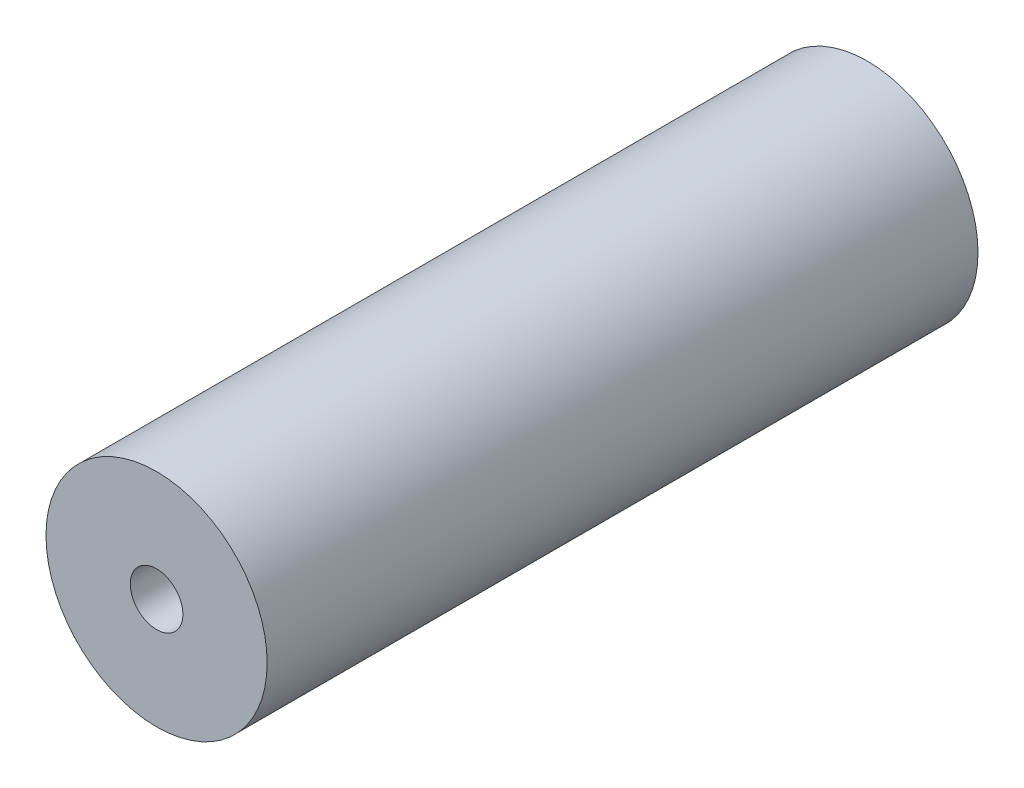
ISO-10303-21;
HEADER;
FILE_DESCRIPTION(('STEP AP214'),'2;1');
FILE_NAME('part.step','',(''),(''),'','','');
FILE_SCHEMA(('AUTOMOTIVE_DESIGN { 1 0 10303 214 1 1 1 1 }'));
ENDSEC;
DATA;
#1=APPLICATION_CONTEXT('core data for automotive mechanical design processes');
#2=APPLICATION_PROTOCOL_DEFINITION('international standard','automotive_design',2000,#1);
#3=PRODUCT_CONTEXT('',#1,'mechanical');
#4=PRODUCT('Part','Part','',(#3));
#5=PRODUCT_RELATED_PRODUCT_CATEGORY('part','',(#4));
#6=PRODUCT_DEFINITION_FORMATION('','',#4);
#7=PRODUCT_DEFINITION_CONTEXT('part definition',#1,'design');
#8=PRODUCT_DEFINITION('design','',#6,#7);
#9=PRODUCT_DEFINITION_SHAPE('','',#8);
#10=(LENGTH_UNIT() NAMED_UNIT(*) SI_UNIT(.MILLI.,.METRE.));
#11=(NAMED_UNIT(*) PLANE_ANGLE_UNIT() SI_UNIT($,.RADIAN.));
#12=(NAMED_UNIT(*) SI_UNIT($,.STERADIAN.) SOLID_ANGLE_UNIT());
#13=UNCERTAINTY_MEASURE_WITH_UNIT(LENGTH_MEASURE(1.E-05),#10,'distance_accuracy_value','');
#14=(GEOMETRIC_REPRESENTATION_CONTEXT(3) GLOBAL_UNCERTAINTY_ASSIGNED_CONTEXT((#13)) GLOBAL_UNIT_ASSIGNED_CONTEXT((#10,
#11,#12)) REPRESENTATION_CONTEXT('',''));
#15=CARTESIAN_POINT('',(0.,0.,0.));
#16=DIRECTION('',(0.,0.,1.));
#17=DIRECTION('',(1.,0.,0.));
#18=AXIS2_PLACEMENT_3D('',#15,#16,#17);
#19=CARTESIAN_POINT('',(0.,0.,-67.5));
#20=DIRECTION('',(0.,0.,1.));
#21=DIRECTION('',(1.,0.,0.));
#22=AXIS2_PLACEMENT_3D('',#19,#20,#21);
#23=CYLINDRICAL_SURFACE('',#22,21.);
#24=CARTESIAN_POINT('',(0.,0.,-67.5));
#25=DIRECTION('',(0.,0.,1.));
#26=DIRECTION('',(1.,0.,0.));
#27=AXIS2_PLACEMENT_3D('',#24,#25,#26);
#28=CIRCLE('',#27,21.);
#29=CARTESIAN_POINT('',(21.,0.,-67.5));
#30=VERTEX_POINT('',#29);
#31=EDGE_CURVE('E10',#30,#30,#28,.T.);
#32=ORIENTED_EDGE('',*,*,#31,.T.);
#33=EDGE_LOOP('',(#32));
#34=FACE_BOUND('',#33,.T.);
#35=CARTESIAN_POINT('',(0.,0.,67.5));
#36=DIRECTION('',(0.,0.,1.));
#37=DIRECTION('',(1.,0.,0.));
#38=AXIS2_PLACEMENT_3D('',#35,#36,#37);
#39=CIRCLE('',#38,21.);
#40=CARTESIAN_POINT('',(21.,0.,67.5));
#41=VERTEX_POINT('',#40);
#42=EDGE_CURVE('E41',#41,#41,#39,.T.);
#43=ORIENTED_EDGE('',*,*,#42,.F.);
#44=EDGE_LOOP('',(#43));
#45=FACE_BOUND('',#44,.T.);
#46=ADVANCED_FACE('F35',(#34,#45),#23,.T.);
#47=CARTESIAN_POINT('',(0.,0.,-67.5));
#48=DIRECTION('',(0.,0.,1.));
#49=DIRECTION('',(1.,0.,0.));
#50=AXIS2_PLACEMENT_3D('',#47,#48,#49);
#51=PLANE('',#50);
#52=CARTESIAN_POINT('',(0.,17.5,-67.5));
#53=DIRECTION('',(0.,0.,-1.));
#54=DIRECTION('',(-1.,0.,0.));
#55=AXIS2_PLACEMENT_3D('',#52,#53,#54);
#56=CIRCLE('',#55,2.);
#57=CARTESIAN_POINT('',(-2.,17.5,-67.5));
#58=VERTEX_POINT('',#57);
#59=EDGE_CURVE('E73',#58,#58,#56,.T.);
#60=ORIENTED_EDGE('',*,*,#59,.F.);
#61=EDGE_LOOP('',(#60));
#62=FACE_BOUND('',#61,.T.);
#63=CARTESIAN_POINT('',(-17.5,0.,-67.5));
#64=DIRECTION('',(0.,0.,-1.));
#65=DIRECTION('',(-1.,0.,0.));
#66=AXIS2_PLACEMENT_3D('',#63,#64,#65);
#67=CIRCLE('',#66,2.);
#68=CARTESIAN_POINT('',(-19.5,0.,-67.5));
#69=VERTEX_POINT('',#68);
#70=EDGE_CURVE('E67',#69,#69,#67,.T.);
#71=ORIENTED_EDGE('',*,*,#70,.F.);
#72=EDGE_LOOP('',(#71));
#73=FACE_BOUND('',#72,.T.);
#74=CARTESIAN_POINT('',(0.,-17.5,-67.5));
#75=DIRECTION('',(0.,0.,-1.));
#76=DIRECTION('',(-1.,0.,0.));
#77=AXIS2_PLACEMENT_3D('',#74,#75,#76);
#78=CIRCLE('',#77,2.);
#79=CARTESIAN_POINT('',(-2.,-17.5,-67.5));
#80=VERTEX_POINT('',#79);
#81=EDGE_CURVE('E61',#80,#80,#78,.T.);
#82=ORIENTED_EDGE('',*,*,#81,.F.);
#83=EDGE_LOOP('',(#82));
#84=FACE_BOUND('',#83,.T.);
#85=CARTESIAN_POINT('',(17.5,0.,-67.5));
#86=DIRECTION('',(0.,0.,-1.));
#87=DIRECTION('',(-1.,0.,0.));
#88=AXIS2_PLACEMENT_3D('',#85,#86,#87);
#89=CIRCLE('',#88,2.);
#90=CARTESIAN_POINT('',(15.5,0.,-67.5));
#91=VERTEX_POINT('',#90);
#92=EDGE_CURVE('E55',#91,#91,#89,.T.);
#93=ORIENTED_EDGE('',*,*,#92,.F.);
#94=EDGE_LOOP('',(#93));
#95=FACE_BOUND('',#94,.T.);
#96=CARTESIAN_POINT('',(0.,0.,-67.5));
#97=DIRECTION('',(0.,0.,1.));
#98=DIRECTION('',(1.,0.,0.));
#99=AXIS2_PLACEMENT_3D('',#96,#97,#98);
#100=CIRCLE('',#99,5.);
#101=CARTESIAN_POINT('',(5.,0.,-67.5));
#102=VERTEX_POINT('',#101);
#103=EDGE_CURVE('E45',#102,#102,#100,.T.);
#104=ORIENTED_EDGE('',*,*,#103,.T.);
#105=EDGE_LOOP('',(#104));
#106=FACE_BOUND('',#105,.T.);
#107=ORIENTED_EDGE('',*,*,#31,.F.);
#108=EDGE_LOOP('',(#107));
#109=FACE_BOUND('',#108,.T.);
#110=ADVANCED_FACE('F88',(#62,#73,#84,#95,#106,#109),#51,.F.);
#111=CARTESIAN_POINT('',(0.,0.,67.5));
#112=DIRECTION('',(0.,0.,1.));
#113=DIRECTION('',(1.,0.,0.));
#114=AXIS2_PLACEMENT_3D('',#111,#112,#113);
#115=PLANE('',#114);
#116=CARTESIAN_POINT('',(0.,0.,67.5));
#117=DIRECTION('',(0.,0.,1.));
#118=DIRECTION('',(1.,0.,0.));
#119=AXIS2_PLACEMENT_3D('',#116,#117,#118);
#120=CIRCLE('',#119,5.);
#121=CARTESIAN_POINT('',(5.,0.,67.5));
#122=VERTEX_POINT('',#121);
#123=EDGE_CURVE('E49',#122,#122,#120,.T.);
#124=ORIENTED_EDGE('',*,*,#123,.F.);
#125=EDGE_LOOP('',(#124));
#126=FACE_BOUND('',#125,.T.);
#127=ORIENTED_EDGE('',*,*,#42,.T.);
#128=EDGE_LOOP('',(#127));
#129=FACE_BOUND('',#128,.T.);
#130=ADVANCED_FACE('F91',(#126,#129),#115,.T.);
#131=CARTESIAN_POINT('',(0.,0.,-67.5));
#132=DIRECTION('',(0.,0.,1.));
#133=DIRECTION('',(1.,0.,0.));
#134=AXIS2_PLACEMENT_3D('',#131,#132,#133);
#135=CYLINDRICAL_SURFACE('',#134,5.);
#136=ORIENTED_EDGE('',*,*,#103,.F.);
#137=EDGE_LOOP('',(#136));
#138=FACE_BOUND('',#137,.T.);
#139=ORIENTED_EDGE('',*,*,#123,.T.);
#140=EDGE_LOOP('',(#139));
#141=FACE_BOUND('',#140,.T.);
#142=ADVANCED_FACE('F101',(#138,#141),#135,.F.);
#143=CARTESIAN_POINT('',(17.5,0.,-58.5));
#144=DIRECTION('',(0.,0.,-1.));
#145=DIRECTION('',(-1.,0.,0.));
#146=AXIS2_PLACEMENT_3D('',#143,#144,#145);
#147=CYLINDRICAL_SURFACE('',#146,2.);
#148=CARTESIAN_POINT('',(17.5,0.,-58.5));
#149=DIRECTION('',(0.,0.,-1.));
#150=DIRECTION('',(-1.,0.,0.));
#151=AXIS2_PLACEMENT_3D('',#148,#149,#150);
#152=CIRCLE('',#151,2.);
#153=CARTESIAN_POINT('',(15.5,0.,-58.5));
#154=VERTEX_POINT('',#153);
#155=EDGE_CURVE('E58',#154,#154,#152,.T.);
#156=ORIENTED_EDGE('',*,*,#155,.F.);
#157=EDGE_LOOP('',(#156));
#158=FACE_BOUND('',#157,.T.);
#159=ORIENTED_EDGE('',*,*,#92,.T.);
#160=EDGE_LOOP('',(#159));
#161=FACE_BOUND('',#160,.T.);
#162=ADVANCED_FACE('F104',(#158,#161),#147,.F.);
#163=CARTESIAN_POINT('',(17.5,0.,-58.5));
#164=DIRECTION('',(0.,0.,-1.));
#165=DIRECTION('',(-1.,0.,0.));
#166=AXIS2_PLACEMENT_3D('',#163,#164,#165);
#167=PLANE('',#166);
#168=ORIENTED_EDGE('',*,*,#155,.T.);
#169=EDGE_LOOP('',(#168));
#170=FACE_BOUND('',#169,.T.);
#171=ADVANCED_FACE('F133',(#170),#167,.T.);
#172=CARTESIAN_POINT('',(0.,-17.5,-58.5));
#173=DIRECTION('',(0.,0.,-1.));
#174=DIRECTION('',(-1.,0.,0.));
#175=AXIS2_PLACEMENT_3D('',#172,#173,#174);
#176=CYLINDRICAL_SURFACE('',#175,2.);
#177=CARTESIAN_POINT('',(0.,-17.5,-58.5));
#178=DIRECTION('',(0.,0.,-1.));
#179=DIRECTION('',(-1.,0.,0.));
#180=AXIS2_PLACEMENT_3D('',#177,#178,#179);
#181=CIRCLE('',#180,2.);
#182=CARTESIAN_POINT('',(-2.,-17.5,-58.5));
#183=VERTEX_POINT('',#182);
#184=EDGE_CURVE('E64',#183,#183,#181,.T.);
#185=ORIENTED_EDGE('',*,*,#184,.F.);
#186=EDGE_LOOP('',(#185));
#187=FACE_BOUND('',#186,.T.);
#188=ORIENTED_EDGE('',*,*,#81,.T.);
#189=EDGE_LOOP('',(#188));
#190=FACE_BOUND('',#189,.T.);
#191=ADVANCED_FACE('F143',(#187,#190),#176,.F.);
#192=CARTESIAN_POINT('',(0.,-17.5,-58.5));
#193=DIRECTION('',(0.,0.,-1.));
#194=DIRECTION('',(-1.,0.,0.));
#195=AXIS2_PLACEMENT_3D('',#192,#193,#194);
#196=PLANE('',#195);
#197=ORIENTED_EDGE('',*,*,#184,.T.);
#198=EDGE_LOOP('',(#197));
#199=FACE_BOUND('',#198,.T.);
#200=ADVANCED_FACE('F153',(#199),#196,.T.);
#201=CARTESIAN_POINT('',(-17.5,0.,-58.5));
#202=DIRECTION('',(0.,0.,-1.));
#203=DIRECTION('',(-1.,0.,0.));
#204=AXIS2_PLACEMENT_3D('',#201,#202,#203);
#205=CYLINDRICAL_SURFACE('',#204,2.);
#206=CARTESIAN_POINT('',(-17.5,0.,-58.5));
#207=DIRECTION('',(0.,0.,-1.));
#208=DIRECTION('',(-1.,0.,0.));
#209=AXIS2_PLACEMENT_3D('',#206,#207,#208);
#210=CIRCLE('',#209,2.);
#211=CARTESIAN_POINT('',(-19.5,0.,-58.5));
#212=VERTEX_POINT('',#211);
#213=EDGE_CURVE('E70',#212,#212,#210,.T.);
#214=ORIENTED_EDGE('',*,*,#213,.F.);
#215=EDGE_LOOP('',(#214));
#216=FACE_BOUND('',#215,.T.);
#217=ORIENTED_EDGE('',*,*,#70,.T.);
#218=EDGE_LOOP('',(#217));
#219=FACE_BOUND('',#218,.T.);
#220=ADVANCED_FACE('F163',(#216,#219),#205,.F.);
#221=CARTESIAN_POINT('',(-17.5,0.,-58.5));
#222=DIRECTION('',(0.,0.,-1.));
#223=DIRECTION('',(-1.,0.,0.));
#224=AXIS2_PLACEMENT_3D('',#221,#222,#223);
#225=PLANE('',#224);
#226=ORIENTED_EDGE('',*,*,#213,.T.);
#227=EDGE_LOOP('',(#226));
#228=FACE_BOUND('',#227,.T.);
#229=ADVANCED_FACE('F84',(#228),#225,.T.);
#230=CARTESIAN_POINT('',(0.,17.5,-58.5));
#231=DIRECTION('',(0.,0.,-1.));
#232=DIRECTION('',(-1.,0.,0.));
#233=AXIS2_PLACEMENT_3D('',#230,#231,#232);
#234=CYLINDRICAL_SURFACE('',#233,2.);
#235=CARTESIAN_POINT('',(0.,17.5,-58.5));
#236=DIRECTION('',(0.,0.,-1.));
#237=DIRECTION('',(-1.,0.,0.));
#238=AXIS2_PLACEMENT_3D('',#235,#236,#237);
#239=CIRCLE('',#238,2.);
#240=CARTESIAN_POINT('',(-2.,17.5,-58.5));
#241=VERTEX_POINT('',#240);
#242=EDGE_CURVE('E53',#241,#241,#239,.T.);
#243=ORIENTED_EDGE('',*,*,#242,.F.);
#244=EDGE_LOOP('',(#243));
#245=FACE_BOUND('',#244,.T.);
#246=ORIENTED_EDGE('',*,*,#59,.T.);
#247=EDGE_LOOP('',(#246));
#248=FACE_BOUND('',#247,.T.);
#249=ADVANCED_FACE('F81',(#245,#248),#234,.F.);
#250=CARTESIAN_POINT('',(0.,17.5,-58.5));
#251=DIRECTION('',(0.,0.,-1.));
#252=DIRECTION('',(-1.,0.,0.));
#253=AXIS2_PLACEMENT_3D('',#250,#251,#252);
#254=PLANE('',#253);
#255=ORIENTED_EDGE('',*,*,#242,.T.);
#256=EDGE_LOOP('',(#255));
#257=FACE_BOUND('',#256,.T.);
#258=ADVANCED_FACE('F79',(#257),#254,.T.);
#259=CLOSED_SHELL('',(#46,#110,#130,#142,#162,#171,#191,#200,#220,#229,#249,#258));
#260=MANIFOLD_SOLID_BREP('B2',#259);
#261=ADVANCED_BREP_SHAPE_REPRESENTATION('',(#18,#260),#14);
#262=SHAPE_DEFINITION_REPRESENTATION(#9,#261);
ENDSEC;
END-ISO-10303-21;
